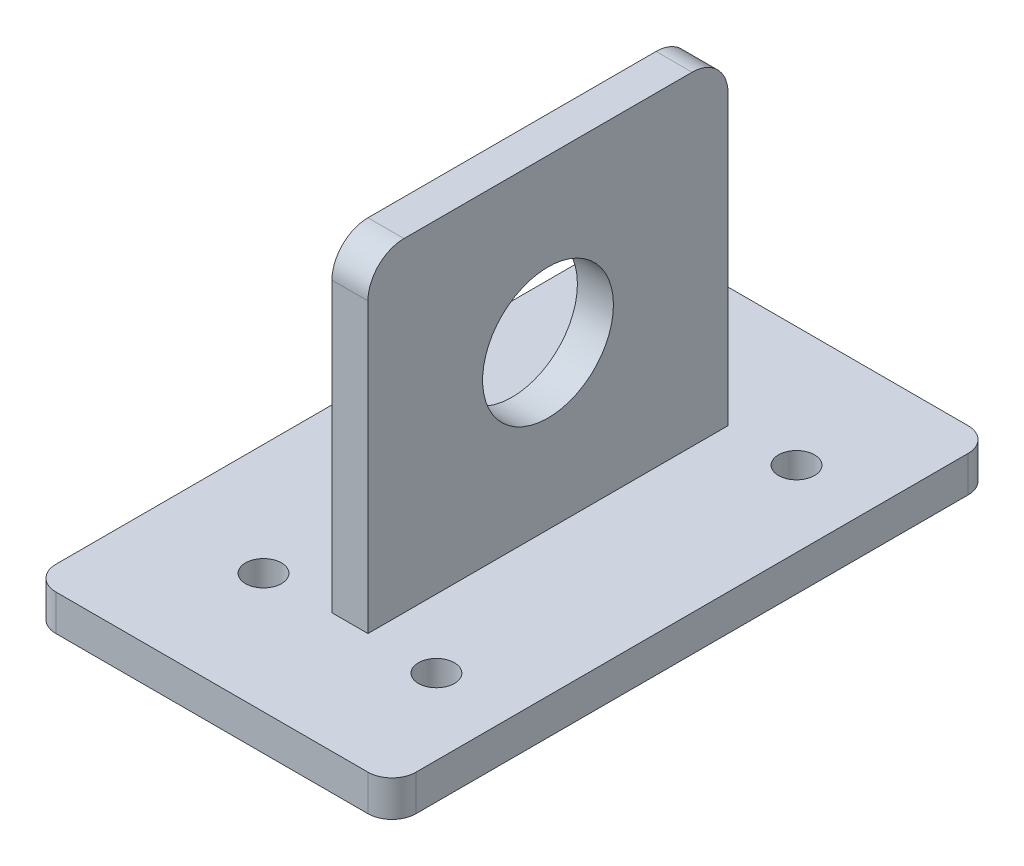
ISO-10303-21;
HEADER;
FILE_DESCRIPTION(('STEP AP214'),'2;1');
FILE_NAME('part.step','',(''),(''),'','','');
FILE_SCHEMA(('AUTOMOTIVE_DESIGN { 1 0 10303 214 1 1 1 1 }'));
ENDSEC;
DATA;
#1=APPLICATION_CONTEXT('core data for automotive mechanical design processes');
#2=APPLICATION_PROTOCOL_DEFINITION('international standard','automotive_design',2000,#1);
#3=PRODUCT_CONTEXT('',#1,'mechanical');
#4=PRODUCT('Part','Part','',(#3));
#5=PRODUCT_RELATED_PRODUCT_CATEGORY('part','',(#4));
#6=PRODUCT_DEFINITION_FORMATION('','',#4);
#7=PRODUCT_DEFINITION_CONTEXT('part definition',#1,'design');
#8=PRODUCT_DEFINITION('design','',#6,#7);
#9=PRODUCT_DEFINITION_SHAPE('','',#8);
#10=(LENGTH_UNIT() NAMED_UNIT(*) SI_UNIT(.MILLI.,.METRE.));
#11=(NAMED_UNIT(*) PLANE_ANGLE_UNIT() SI_UNIT($,.RADIAN.));
#12=(NAMED_UNIT(*) SI_UNIT($,.STERADIAN.) SOLID_ANGLE_UNIT());
#13=UNCERTAINTY_MEASURE_WITH_UNIT(LENGTH_MEASURE(1.E-05),#10,'distance_accuracy_value','');
#14=(GEOMETRIC_REPRESENTATION_CONTEXT(3) GLOBAL_UNCERTAINTY_ASSIGNED_CONTEXT((#13)) GLOBAL_UNIT_ASSIGNED_CONTEXT((#10,
#11,#12)) REPRESENTATION_CONTEXT('',''));
#15=CARTESIAN_POINT('',(0.,0.,0.));
#16=DIRECTION('',(0.,0.,1.));
#17=DIRECTION('',(1.,0.,0.));
#18=AXIS2_PLACEMENT_3D('',#15,#16,#17);
#19=CARTESIAN_POINT('',(0.,3.,0.));
#20=DIRECTION('',(0.,1.,0.));
#21=DIRECTION('',(0.,0.,1.));
#22=AXIS2_PLACEMENT_3D('',#19,#20,#21);
#23=PLANE('',#22);
#24=CARTESIAN_POINT('',(8.70350482965409,3.,15.));
#25=DIRECTION('',(0.,1.,0.));
#26=DIRECTION('',(0.,0.,-1.));
#27=AXIS2_PLACEMENT_3D('',#24,#25,#26);
#28=CIRCLE('',#27,1.5);
#29=CARTESIAN_POINT('',(8.70350482965409,3.,13.5));
#30=VERTEX_POINT('',#29);
#31=EDGE_CURVE('E280',#30,#30,#28,.T.);
#32=ORIENTED_EDGE('',*,*,#31,.F.);
#33=EDGE_LOOP('',(#32));
#34=FACE_BOUND('',#33,.T.);
#35=CARTESIAN_POINT('',(-5.70350482965409,3.,15.));
#36=DIRECTION('',(0.,-1.,0.));
#37=DIRECTION('',(0.,0.,-1.));
#38=AXIS2_PLACEMENT_3D('',#35,#36,#37);
#39=CIRCLE('',#38,1.5);
#40=CARTESIAN_POINT('',(-5.70350482965409,3.,13.5));
#41=VERTEX_POINT('',#40);
#42=EDGE_CURVE('E268',#41,#41,#39,.T.);
#43=ORIENTED_EDGE('',*,*,#42,.T.);
#44=EDGE_LOOP('',(#43));
#45=FACE_BOUND('',#44,.T.);
#46=CARTESIAN_POINT('',(-5.70350482965409,3.,-15.));
#47=DIRECTION('',(0.,1.,0.));
#48=DIRECTION('',(0.,0.,1.));
#49=AXIS2_PLACEMENT_3D('',#46,#47,#48);
#50=CIRCLE('',#49,1.5);
#51=CARTESIAN_POINT('',(-5.70350482965409,3.,-13.5));
#52=VERTEX_POINT('',#51);
#53=EDGE_CURVE('E262',#52,#52,#50,.T.);
#54=ORIENTED_EDGE('',*,*,#53,.F.);
#55=EDGE_LOOP('',(#54));
#56=FACE_BOUND('',#55,.T.);
#57=DIRECTION('',(0.,0.,-1.));
#58=VECTOR('',#57,1.);
#59=CARTESIAN_POINT('',(3.,3.,0.));
#60=LINE('',#59,#58);
#61=CARTESIAN_POINT('',(3.,3.,15.));
#62=VERTEX_POINT('',#61);
#63=CARTESIAN_POINT('',(3.,3.,-15.));
#64=VERTEX_POINT('',#63);
#65=EDGE_CURVE('E158',#62,#64,#60,.T.);
#66=ORIENTED_EDGE('',*,*,#65,.F.);
#67=DIRECTION('',(-1.,0.,0.));
#68=VECTOR('',#67,1.);
#69=CARTESIAN_POINT('',(0.,3.,15.));
#70=LINE('',#69,#68);
#71=CARTESIAN_POINT('',(0.,3.,15.));
#72=VERTEX_POINT('',#71);
#73=EDGE_CURVE('E144',#62,#72,#70,.T.);
#74=ORIENTED_EDGE('',*,*,#73,.T.);
#75=DIRECTION('',(0.,0.,-1.));
#76=VECTOR('',#75,1.);
#77=CARTESIAN_POINT('',(0.,3.,0.));
#78=LINE('',#77,#76);
#79=CARTESIAN_POINT('',(0.,3.,-15.));
#80=VERTEX_POINT('',#79);
#81=EDGE_CURVE('E153',#72,#80,#78,.T.);
#82=ORIENTED_EDGE('',*,*,#81,.T.);
#83=DIRECTION('',(1.,0.,0.));
#84=VECTOR('',#83,1.);
#85=CARTESIAN_POINT('',(0.,3.,-15.));
#86=LINE('',#85,#84);
#87=EDGE_CURVE('E163',#80,#64,#86,.T.);
#88=ORIENTED_EDGE('',*,*,#87,.T.);
#89=EDGE_LOOP('',(#66,#74,#82,#88));
#90=FACE_BOUND('',#89,.T.);
#91=DIRECTION('',(1.,0.,0.));
#92=VECTOR('',#91,1.);
#93=CARTESIAN_POINT('',(15.,3.,25.));
#94=LINE('',#93,#92);
#95=CARTESIAN_POINT('',(-13.,3.,25.));
#96=VERTEX_POINT('',#95);
#97=CARTESIAN_POINT('',(13.,3.,25.));
#98=VERTEX_POINT('',#97);
#99=EDGE_CURVE('E174',#96,#98,#94,.T.);
#100=ORIENTED_EDGE('',*,*,#99,.T.);
#101=CARTESIAN_POINT('',(13.,3.,23.));
#102=DIRECTION('',(0.,1.,0.));
#103=DIRECTION('',(0.,0.,1.));
#104=AXIS2_PLACEMENT_3D('',#101,#102,#103);
#105=CIRCLE('',#104,2.);
#106=CARTESIAN_POINT('',(15.,3.,23.));
#107=VERTEX_POINT('',#106);
#108=EDGE_CURVE('E215',#98,#107,#105,.T.);
#109=ORIENTED_EDGE('',*,*,#108,.T.);
#110=DIRECTION('',(0.,0.,-1.));
#111=VECTOR('',#110,1.);
#112=CARTESIAN_POINT('',(15.,3.,25.));
#113=LINE('',#112,#111);
#114=CARTESIAN_POINT('',(15.,3.,-23.));
#115=VERTEX_POINT('',#114);
#116=EDGE_CURVE('E178',#107,#115,#113,.T.);
#117=ORIENTED_EDGE('',*,*,#116,.T.);
#118=CARTESIAN_POINT('',(13.,3.,-23.));
#119=DIRECTION('',(0.,1.,0.));
#120=DIRECTION('',(0.,0.,1.));
#121=AXIS2_PLACEMENT_3D('',#118,#119,#120);
#122=CIRCLE('',#121,2.);
#123=CARTESIAN_POINT('',(13.,3.,-25.));
#124=VERTEX_POINT('',#123);
#125=EDGE_CURVE('E211',#115,#124,#122,.T.);
#126=ORIENTED_EDGE('',*,*,#125,.T.);
#127=DIRECTION('',(-1.,0.,0.));
#128=VECTOR('',#127,1.);
#129=CARTESIAN_POINT('',(15.,3.,-25.));
#130=LINE('',#129,#128);
#131=CARTESIAN_POINT('',(-13.,3.,-25.));
#132=VERTEX_POINT('',#131);
#133=EDGE_CURVE('E181',#124,#132,#130,.T.);
#134=ORIENTED_EDGE('',*,*,#133,.T.);
#135=CARTESIAN_POINT('',(-13.,3.,-23.));
#136=DIRECTION('',(0.,1.,0.));
#137=DIRECTION('',(0.,0.,1.));
#138=AXIS2_PLACEMENT_3D('',#135,#136,#137);
#139=CIRCLE('',#138,2.);
#140=CARTESIAN_POINT('',(-15.,3.,-23.));
#141=VERTEX_POINT('',#140);
#142=EDGE_CURVE('E209',#132,#141,#139,.T.);
#143=ORIENTED_EDGE('',*,*,#142,.T.);
#144=DIRECTION('',(0.,0.,1.));
#145=VECTOR('',#144,1.);
#146=CARTESIAN_POINT('',(-15.,3.,25.));
#147=LINE('',#146,#145);
#148=CARTESIAN_POINT('',(-15.,3.,23.));
#149=VERTEX_POINT('',#148);
#150=EDGE_CURVE('E171',#141,#149,#147,.T.);
#151=ORIENTED_EDGE('',*,*,#150,.T.);
#152=CARTESIAN_POINT('',(-13.,3.,23.));
#153=DIRECTION('',(0.,1.,0.));
#154=DIRECTION('',(0.,0.,1.));
#155=AXIS2_PLACEMENT_3D('',#152,#153,#154);
#156=CIRCLE('',#155,2.);
#157=EDGE_CURVE('E213',#149,#96,#156,.T.);
#158=ORIENTED_EDGE('',*,*,#157,.T.);
#159=EDGE_LOOP('',(#100,#109,#117,#126,#134,#143,#151,#158));
#160=FACE_BOUND('',#159,.T.);
#161=CARTESIAN_POINT('',(8.70350482965409,3.,-15.));
#162=DIRECTION('',(0.,-1.,0.));
#163=DIRECTION('',(0.,0.,1.));
#164=AXIS2_PLACEMENT_3D('',#161,#162,#163);
#165=CIRCLE('',#164,1.5);
#166=CARTESIAN_POINT('',(8.70350482965409,3.,-13.5));
#167=VERTEX_POINT('',#166);
#168=EDGE_CURVE('E274',#167,#167,#165,.T.);
#169=ORIENTED_EDGE('',*,*,#168,.T.);
#170=EDGE_LOOP('',(#169));
#171=FACE_BOUND('',#170,.T.);
#172=ADVANCED_FACE('F35',(#34,#45,#56,#90,#160,#171),#23,.T.);
#173=CARTESIAN_POINT('',(0.,0.,0.));
#174=DIRECTION('',(0.,1.,0.));
#175=DIRECTION('',(0.,0.,1.));
#176=AXIS2_PLACEMENT_3D('',#173,#174,#175);
#177=PLANE('',#176);
#178=CARTESIAN_POINT('',(8.70350482965409,0.,15.));
#179=DIRECTION('',(0.,1.,0.));
#180=DIRECTION('',(0.,0.,-1.));
#181=AXIS2_PLACEMENT_3D('',#178,#179,#180);
#182=CIRCLE('',#181,1.5);
#183=CARTESIAN_POINT('',(8.70350482965409,0.,13.5));
#184=VERTEX_POINT('',#183);
#185=EDGE_CURVE('E277',#184,#184,#182,.T.);
#186=ORIENTED_EDGE('',*,*,#185,.T.);
#187=EDGE_LOOP('',(#186));
#188=FACE_BOUND('',#187,.T.);
#189=CARTESIAN_POINT('',(-5.70350482965409,0.,15.));
#190=DIRECTION('',(0.,-1.,0.));
#191=DIRECTION('',(0.,0.,-1.));
#192=AXIS2_PLACEMENT_3D('',#189,#190,#191);
#193=CIRCLE('',#192,1.5);
#194=CARTESIAN_POINT('',(-5.70350482965409,0.,13.5));
#195=VERTEX_POINT('',#194);
#196=EDGE_CURVE('E265',#195,#195,#193,.T.);
#197=ORIENTED_EDGE('',*,*,#196,.F.);
#198=EDGE_LOOP('',(#197));
#199=FACE_BOUND('',#198,.T.);
#200=CARTESIAN_POINT('',(-5.70350482965409,0.,-15.));
#201=DIRECTION('',(0.,1.,0.));
#202=DIRECTION('',(0.,0.,1.));
#203=AXIS2_PLACEMENT_3D('',#200,#201,#202);
#204=CIRCLE('',#203,1.5);
#205=CARTESIAN_POINT('',(-5.70350482965409,0.,-13.5));
#206=VERTEX_POINT('',#205);
#207=EDGE_CURVE('E259',#206,#206,#204,.T.);
#208=ORIENTED_EDGE('',*,*,#207,.T.);
#209=EDGE_LOOP('',(#208));
#210=FACE_BOUND('',#209,.T.);
#211=DIRECTION('',(0.,0.,-1.));
#212=VECTOR('',#211,1.);
#213=CARTESIAN_POINT('',(15.,0.,25.));
#214=LINE('',#213,#212);
#215=CARTESIAN_POINT('',(15.,0.,23.));
#216=VERTEX_POINT('',#215);
#217=CARTESIAN_POINT('',(15.,0.,-23.));
#218=VERTEX_POINT('',#217);
#219=EDGE_CURVE('E187',#216,#218,#214,.T.);
#220=ORIENTED_EDGE('',*,*,#219,.F.);
#221=CARTESIAN_POINT('',(13.,0.,23.));
#222=DIRECTION('',(0.,1.,0.));
#223=DIRECTION('',(0.,0.,1.));
#224=AXIS2_PLACEMENT_3D('',#221,#222,#223);
#225=CIRCLE('',#224,2.);
#226=CARTESIAN_POINT('',(13.,0.,25.));
#227=VERTEX_POINT('',#226);
#228=EDGE_CURVE('E202',#216,#227,#225,.F.);
#229=ORIENTED_EDGE('',*,*,#228,.T.);
#230=DIRECTION('',(1.,0.,0.));
#231=VECTOR('',#230,1.);
#232=CARTESIAN_POINT('',(15.,0.,25.));
#233=LINE('',#232,#231);
#234=CARTESIAN_POINT('',(-13.,0.,25.));
#235=VERTEX_POINT('',#234);
#236=EDGE_CURVE('E166',#235,#227,#233,.T.);
#237=ORIENTED_EDGE('',*,*,#236,.F.);
#238=CARTESIAN_POINT('',(-13.,0.,23.));
#239=DIRECTION('',(0.,1.,0.));
#240=DIRECTION('',(0.,0.,1.));
#241=AXIS2_PLACEMENT_3D('',#238,#239,#240);
#242=CIRCLE('',#241,2.);
#243=CARTESIAN_POINT('',(-15.,0.,23.));
#244=VERTEX_POINT('',#243);
#245=EDGE_CURVE('E200',#235,#244,#242,.F.);
#246=ORIENTED_EDGE('',*,*,#245,.T.);
#247=DIRECTION('',(0.,0.,1.));
#248=VECTOR('',#247,1.);
#249=CARTESIAN_POINT('',(-15.,0.,25.));
#250=LINE('',#249,#248);
#251=CARTESIAN_POINT('',(-15.,0.,-23.));
#252=VERTEX_POINT('',#251);
#253=EDGE_CURVE('E162',#252,#244,#250,.T.);
#254=ORIENTED_EDGE('',*,*,#253,.F.);
#255=CARTESIAN_POINT('',(-13.,0.,-23.));
#256=DIRECTION('',(0.,1.,0.));
#257=DIRECTION('',(0.,0.,1.));
#258=AXIS2_PLACEMENT_3D('',#255,#256,#257);
#259=CIRCLE('',#258,2.);
#260=CARTESIAN_POINT('',(-13.,0.,-25.));
#261=VERTEX_POINT('',#260);
#262=EDGE_CURVE('E196',#252,#261,#259,.F.);
#263=ORIENTED_EDGE('',*,*,#262,.T.);
#264=DIRECTION('',(-1.,0.,0.));
#265=VECTOR('',#264,1.);
#266=CARTESIAN_POINT('',(15.,0.,-25.));
#267=LINE('',#266,#265);
#268=CARTESIAN_POINT('',(13.,0.,-25.));
#269=VERTEX_POINT('',#268);
#270=EDGE_CURVE('E175',#269,#261,#267,.T.);
#271=ORIENTED_EDGE('',*,*,#270,.F.);
#272=CARTESIAN_POINT('',(13.,0.,-23.));
#273=DIRECTION('',(0.,1.,0.));
#274=DIRECTION('',(0.,0.,1.));
#275=AXIS2_PLACEMENT_3D('',#272,#273,#274);
#276=CIRCLE('',#275,2.);
#277=EDGE_CURVE('E198',#269,#218,#276,.F.);
#278=ORIENTED_EDGE('',*,*,#277,.T.);
#279=EDGE_LOOP('',(#220,#229,#237,#246,#254,#263,#271,#278));
#280=FACE_BOUND('',#279,.T.);
#281=CARTESIAN_POINT('',(8.70350482965409,0.,-15.));
#282=DIRECTION('',(0.,-1.,0.));
#283=DIRECTION('',(0.,0.,1.));
#284=AXIS2_PLACEMENT_3D('',#281,#282,#283);
#285=CIRCLE('',#284,1.5);
#286=CARTESIAN_POINT('',(8.70350482965409,0.,-13.5));
#287=VERTEX_POINT('',#286);
#288=EDGE_CURVE('E271',#287,#287,#285,.T.);
#289=ORIENTED_EDGE('',*,*,#288,.F.);
#290=EDGE_LOOP('',(#289));
#291=FACE_BOUND('',#290,.T.);
#292=ADVANCED_FACE('F286',(#188,#199,#210,#280,#291),#177,.F.);
#293=CARTESIAN_POINT('',(-15.,3.,25.));
#294=DIRECTION('',(1.,0.,0.));
#295=DIRECTION('',(0.,0.,-1.));
#296=AXIS2_PLACEMENT_3D('',#293,#294,#295);
#297=PLANE('',#296);
#298=ORIENTED_EDGE('',*,*,#253,.T.);
#299=DIRECTION('',(0.,-1.,0.));
#300=VECTOR('',#299,1.);
#301=CARTESIAN_POINT('',(-15.,3.,23.));
#302=LINE('',#301,#300);
#303=EDGE_CURVE('E220',#244,#149,#302,.F.);
#304=ORIENTED_EDGE('',*,*,#303,.T.);
#305=ORIENTED_EDGE('',*,*,#150,.F.);
#306=DIRECTION('',(0.,-1.,0.));
#307=VECTOR('',#306,1.);
#308=CARTESIAN_POINT('',(-15.,3.,-23.));
#309=LINE('',#308,#307);
#310=EDGE_CURVE('E217',#141,#252,#309,.T.);
#311=ORIENTED_EDGE('',*,*,#310,.T.);
#312=EDGE_LOOP('',(#298,#304,#305,#311));
#313=FACE_BOUND('',#312,.T.);
#314=ADVANCED_FACE('F338',(#313),#297,.F.);
#315=CARTESIAN_POINT('',(15.,3.,25.));
#316=DIRECTION('',(0.,0.,-1.));
#317=DIRECTION('',(-1.,0.,0.));
#318=AXIS2_PLACEMENT_3D('',#315,#316,#317);
#319=PLANE('',#318);
#320=ORIENTED_EDGE('',*,*,#236,.T.);
#321=DIRECTION('',(0.,-1.,0.));
#322=VECTOR('',#321,1.);
#323=CARTESIAN_POINT('',(13.,3.,25.));
#324=LINE('',#323,#322);
#325=EDGE_CURVE('E207',#227,#98,#324,.F.);
#326=ORIENTED_EDGE('',*,*,#325,.T.);
#327=ORIENTED_EDGE('',*,*,#99,.F.);
#328=DIRECTION('',(0.,-1.,0.));
#329=VECTOR('',#328,1.);
#330=CARTESIAN_POINT('',(-13.,3.,25.));
#331=LINE('',#330,#329);
#332=EDGE_CURVE('E204',#96,#235,#331,.T.);
#333=ORIENTED_EDGE('',*,*,#332,.T.);
#334=EDGE_LOOP('',(#320,#326,#327,#333));
#335=FACE_BOUND('',#334,.T.);
#336=ADVANCED_FACE('F345',(#335),#319,.F.);
#337=CARTESIAN_POINT('',(15.,3.,25.));
#338=DIRECTION('',(-1.,0.,0.));
#339=DIRECTION('',(0.,0.,1.));
#340=AXIS2_PLACEMENT_3D('',#337,#338,#339);
#341=PLANE('',#340);
#342=ORIENTED_EDGE('',*,*,#116,.F.);
#343=DIRECTION('',(0.,-1.,0.));
#344=VECTOR('',#343,1.);
#345=CARTESIAN_POINT('',(15.,3.,23.));
#346=LINE('',#345,#344);
#347=EDGE_CURVE('E193',#107,#216,#346,.T.);
#348=ORIENTED_EDGE('',*,*,#347,.T.);
#349=ORIENTED_EDGE('',*,*,#219,.T.);
#350=DIRECTION('',(0.,-1.,0.));
#351=VECTOR('',#350,1.);
#352=CARTESIAN_POINT('',(15.,3.,-23.));
#353=LINE('',#352,#351);
#354=EDGE_CURVE('E183',#218,#115,#353,.F.);
#355=ORIENTED_EDGE('',*,*,#354,.T.);
#356=EDGE_LOOP('',(#342,#348,#349,#355));
#357=FACE_BOUND('',#356,.T.);
#358=ADVANCED_FACE('F341',(#357),#341,.F.);
#359=CARTESIAN_POINT('',(15.,3.,-25.));
#360=DIRECTION('',(0.,0.,1.));
#361=DIRECTION('',(1.,0.,0.));
#362=AXIS2_PLACEMENT_3D('',#359,#360,#361);
#363=PLANE('',#362);
#364=ORIENTED_EDGE('',*,*,#133,.F.);
#365=DIRECTION('',(0.,-1.,0.));
#366=VECTOR('',#365,1.);
#367=CARTESIAN_POINT('',(13.,3.,-25.));
#368=LINE('',#367,#366);
#369=EDGE_CURVE('E224',#124,#269,#368,.T.);
#370=ORIENTED_EDGE('',*,*,#369,.T.);
#371=ORIENTED_EDGE('',*,*,#270,.T.);
#372=DIRECTION('',(0.,-1.,0.));
#373=VECTOR('',#372,1.);
#374=CARTESIAN_POINT('',(-13.,3.,-25.));
#375=LINE('',#374,#373);
#376=EDGE_CURVE('E222',#261,#132,#375,.F.);
#377=ORIENTED_EDGE('',*,*,#376,.T.);
#378=EDGE_LOOP('',(#364,#370,#371,#377));
#379=FACE_BOUND('',#378,.T.);
#380=ADVANCED_FACE('F334',(#379),#363,.F.);
#381=CARTESIAN_POINT('',(3.,0.,15.));
#382=DIRECTION('',(0.,0.,-1.));
#383=DIRECTION('',(-1.,0.,0.));
#384=AXIS2_PLACEMENT_3D('',#381,#382,#383);
#385=PLANE('',#384);
#386=DIRECTION('',(0.,-1.,0.));
#387=VECTOR('',#386,1.);
#388=CARTESIAN_POINT('',(3.,0.,15.));
#389=LINE('',#388,#387);
#390=CARTESIAN_POINT('',(3.,27.,15.));
#391=VERTEX_POINT('',#390);
#392=EDGE_CURVE('E240',#391,#62,#389,.T.);
#393=ORIENTED_EDGE('',*,*,#392,.F.);
#394=DIRECTION('',(-1.,0.,0.));
#395=VECTOR('',#394,1.);
#396=CARTESIAN_POINT('',(3.,27.,15.));
#397=LINE('',#396,#395);
#398=CARTESIAN_POINT('',(0.,27.,15.));
#399=VERTEX_POINT('',#398);
#400=EDGE_CURVE('E147',#391,#399,#397,.T.);
#401=ORIENTED_EDGE('',*,*,#400,.T.);
#402=DIRECTION('',(0.,-1.,0.));
#403=VECTOR('',#402,1.);
#404=CARTESIAN_POINT('',(0.,0.,15.));
#405=LINE('',#404,#403);
#406=EDGE_CURVE('E139',#399,#72,#405,.T.);
#407=ORIENTED_EDGE('',*,*,#406,.T.);
#408=ORIENTED_EDGE('',*,*,#73,.F.);
#409=EDGE_LOOP('',(#393,#401,#407,#408));
#410=FACE_BOUND('',#409,.T.);
#411=ADVANCED_FACE('F142',(#410),#385,.F.);
#412=CARTESIAN_POINT('',(3.,0.,-15.));
#413=DIRECTION('',(0.,0.,1.));
#414=DIRECTION('',(1.,0.,0.));
#415=AXIS2_PLACEMENT_3D('',#412,#413,#414);
#416=PLANE('',#415);
#417=DIRECTION('',(0.,1.,0.));
#418=VECTOR('',#417,1.);
#419=CARTESIAN_POINT('',(0.,0.,-15.));
#420=LINE('',#419,#418);
#421=CARTESIAN_POINT('',(0.,27.,-15.));
#422=VERTEX_POINT('',#421);
#423=EDGE_CURVE('E149',#80,#422,#420,.T.);
#424=ORIENTED_EDGE('',*,*,#423,.T.);
#425=DIRECTION('',(-1.,0.,0.));
#426=VECTOR('',#425,1.);
#427=CARTESIAN_POINT('',(3.,27.,-15.));
#428=LINE('',#427,#426);
#429=CARTESIAN_POINT('',(3.,27.,-15.));
#430=VERTEX_POINT('',#429);
#431=EDGE_CURVE('E11',#422,#430,#428,.F.);
#432=ORIENTED_EDGE('',*,*,#431,.T.);
#433=DIRECTION('',(0.,1.,0.));
#434=VECTOR('',#433,1.);
#435=CARTESIAN_POINT('',(3.,0.,-15.));
#436=LINE('',#435,#434);
#437=EDGE_CURVE('E242',#64,#430,#436,.T.);
#438=ORIENTED_EDGE('',*,*,#437,.F.);
#439=ORIENTED_EDGE('',*,*,#87,.F.);
#440=EDGE_LOOP('',(#424,#432,#438,#439));
#441=FACE_BOUND('',#440,.T.);
#442=ADVANCED_FACE('F252',(#441),#416,.F.);
#443=CARTESIAN_POINT('',(3.,30.,-15.));
#444=DIRECTION('',(0.,-1.,0.));
#445=DIRECTION('',(0.,0.,-1.));
#446=AXIS2_PLACEMENT_3D('',#443,#444,#445);
#447=PLANE('',#446);
#448=DIRECTION('',(0.,0.,1.));
#449=VECTOR('',#448,1.);
#450=CARTESIAN_POINT('',(0.,30.,-15.));
#451=LINE('',#450,#449);
#452=CARTESIAN_POINT('',(0.,30.,-12.));
#453=VERTEX_POINT('',#452);
#454=CARTESIAN_POINT('',(0.,30.,12.));
#455=VERTEX_POINT('',#454);
#456=EDGE_CURVE('E243',#453,#455,#451,.T.);
#457=ORIENTED_EDGE('',*,*,#456,.T.);
#458=DIRECTION('',(-1.,0.,0.));
#459=VECTOR('',#458,1.);
#460=CARTESIAN_POINT('',(3.,30.,12.));
#461=LINE('',#460,#459);
#462=CARTESIAN_POINT('',(3.,30.,12.));
#463=VERTEX_POINT('',#462);
#464=EDGE_CURVE('E56',#455,#463,#461,.F.);
#465=ORIENTED_EDGE('',*,*,#464,.T.);
#466=DIRECTION('',(0.,0.,1.));
#467=VECTOR('',#466,1.);
#468=CARTESIAN_POINT('',(3.,30.,-15.));
#469=LINE('',#468,#467);
#470=CARTESIAN_POINT('',(3.,30.,-12.));
#471=VERTEX_POINT('',#470);
#472=EDGE_CURVE('E159',#471,#463,#469,.T.);
#473=ORIENTED_EDGE('',*,*,#472,.F.);
#474=DIRECTION('',(-1.,0.,0.));
#475=VECTOR('',#474,1.);
#476=CARTESIAN_POINT('',(3.,30.,-12.));
#477=LINE('',#476,#475);
#478=EDGE_CURVE('E232',#471,#453,#477,.T.);
#479=ORIENTED_EDGE('',*,*,#478,.T.);
#480=EDGE_LOOP('',(#457,#465,#473,#479));
#481=FACE_BOUND('',#480,.T.);
#482=ADVANCED_FACE('F247',(#481),#447,.F.);
#483=CARTESIAN_POINT('',(3.,0.,0.));
#484=DIRECTION('',(1.,0.,0.));
#485=DIRECTION('',(0.,0.,-1.));
#486=AXIS2_PLACEMENT_3D('',#483,#484,#485);
#487=PLANE('',#486);
#488=CARTESIAN_POINT('',(3.,16.5,0.));
#489=DIRECTION('',(1.,0.,0.));
#490=DIRECTION('',(0.,0.,-1.));
#491=AXIS2_PLACEMENT_3D('',#488,#489,#490);
#492=CIRCLE('',#491,5.45);
#493=CARTESIAN_POINT('',(3.,16.5,-5.45));
#494=VERTEX_POINT('',#493);
#495=EDGE_CURVE('E256',#494,#494,#492,.T.);
#496=ORIENTED_EDGE('',*,*,#495,.F.);
#497=EDGE_LOOP('',(#496));
#498=FACE_BOUND('',#497,.T.);
#499=ORIENTED_EDGE('',*,*,#472,.T.);
#500=CARTESIAN_POINT('',(3.,27.,12.));
#501=DIRECTION('',(1.,0.,0.));
#502=DIRECTION('',(0.,0.,-1.));
#503=AXIS2_PLACEMENT_3D('',#500,#501,#502);
#504=CIRCLE('',#503,3.);
#505=EDGE_CURVE('E43',#463,#391,#504,.T.);
#506=ORIENTED_EDGE('',*,*,#505,.T.);
#507=ORIENTED_EDGE('',*,*,#392,.T.);
#508=ORIENTED_EDGE('',*,*,#65,.T.);
#509=ORIENTED_EDGE('',*,*,#437,.T.);
#510=CARTESIAN_POINT('',(3.,27.,-12.));
#511=DIRECTION('',(1.,0.,0.));
#512=DIRECTION('',(0.,0.,-1.));
#513=AXIS2_PLACEMENT_3D('',#510,#511,#512);
#514=CIRCLE('',#513,3.);
#515=EDGE_CURVE('E236',#430,#471,#514,.T.);
#516=ORIENTED_EDGE('',*,*,#515,.T.);
#517=EDGE_LOOP('',(#499,#506,#507,#508,#509,#516));
#518=FACE_BOUND('',#517,.T.);
#519=ADVANCED_FACE('F239',(#498,#518),#487,.T.);
#520=CARTESIAN_POINT('',(0.,0.,0.));
#521=DIRECTION('',(1.,0.,0.));
#522=DIRECTION('',(0.,0.,-1.));
#523=AXIS2_PLACEMENT_3D('',#520,#521,#522);
#524=PLANE('',#523);
#525=CARTESIAN_POINT('',(0.,16.5,0.));
#526=DIRECTION('',(1.,0.,0.));
#527=DIRECTION('',(0.,0.,-1.));
#528=AXIS2_PLACEMENT_3D('',#525,#526,#527);
#529=CIRCLE('',#528,5.45);
#530=CARTESIAN_POINT('',(0.,16.5,-5.45));
#531=VERTEX_POINT('',#530);
#532=EDGE_CURVE('E150',#531,#531,#529,.T.);
#533=ORIENTED_EDGE('',*,*,#532,.T.);
#534=EDGE_LOOP('',(#533));
#535=FACE_BOUND('',#534,.T.);
#536=ORIENTED_EDGE('',*,*,#406,.F.);
#537=CARTESIAN_POINT('',(0.,27.,12.));
#538=DIRECTION('',(1.,0.,0.));
#539=DIRECTION('',(0.,0.,-1.));
#540=AXIS2_PLACEMENT_3D('',#537,#538,#539);
#541=CIRCLE('',#540,3.);
#542=EDGE_CURVE('E230',#399,#455,#541,.F.);
#543=ORIENTED_EDGE('',*,*,#542,.T.);
#544=ORIENTED_EDGE('',*,*,#456,.F.);
#545=CARTESIAN_POINT('',(0.,27.,-12.));
#546=DIRECTION('',(1.,0.,0.));
#547=DIRECTION('',(0.,0.,-1.));
#548=AXIS2_PLACEMENT_3D('',#545,#546,#547);
#549=CIRCLE('',#548,3.);
#550=EDGE_CURVE('E228',#453,#422,#549,.F.);
#551=ORIENTED_EDGE('',*,*,#550,.T.);
#552=ORIENTED_EDGE('',*,*,#423,.F.);
#553=ORIENTED_EDGE('',*,*,#81,.F.);
#554=EDGE_LOOP('',(#536,#543,#544,#551,#552,#553));
#555=FACE_BOUND('',#554,.T.);
#556=ADVANCED_FACE('F154',(#535,#555),#524,.F.);
#557=CARTESIAN_POINT('',(0.,16.5,0.));
#558=DIRECTION('',(1.,0.,0.));
#559=DIRECTION('',(0.,0.,-1.));
#560=AXIS2_PLACEMENT_3D('',#557,#558,#559);
#561=CYLINDRICAL_SURFACE('',#560,5.45);
#562=ORIENTED_EDGE('',*,*,#532,.F.);
#563=EDGE_LOOP('',(#562));
#564=FACE_BOUND('',#563,.T.);
#565=ORIENTED_EDGE('',*,*,#495,.T.);
#566=EDGE_LOOP('',(#565));
#567=FACE_BOUND('',#566,.T.);
#568=ADVANCED_FACE('F318',(#564,#567),#561,.F.);
#569=CARTESIAN_POINT('',(13.,3.,23.));
#570=DIRECTION('',(0.,-1.,0.));
#571=DIRECTION('',(0.,0.,-1.));
#572=AXIS2_PLACEMENT_3D('',#569,#570,#571);
#573=CYLINDRICAL_SURFACE('',#572,2.);
#574=ORIENTED_EDGE('',*,*,#108,.F.);
#575=ORIENTED_EDGE('',*,*,#325,.F.);
#576=ORIENTED_EDGE('',*,*,#228,.F.);
#577=ORIENTED_EDGE('',*,*,#347,.F.);
#578=EDGE_LOOP('',(#574,#575,#576,#577));
#579=FACE_BOUND('',#578,.T.);
#580=ADVANCED_FACE('F321',(#579),#573,.T.);
#581=CARTESIAN_POINT('',(-13.,3.,23.));
#582=DIRECTION('',(0.,-1.,0.));
#583=DIRECTION('',(0.,0.,-1.));
#584=AXIS2_PLACEMENT_3D('',#581,#582,#583);
#585=CYLINDRICAL_SURFACE('',#584,2.);
#586=ORIENTED_EDGE('',*,*,#157,.F.);
#587=ORIENTED_EDGE('',*,*,#303,.F.);
#588=ORIENTED_EDGE('',*,*,#245,.F.);
#589=ORIENTED_EDGE('',*,*,#332,.F.);
#590=EDGE_LOOP('',(#586,#587,#588,#589));
#591=FACE_BOUND('',#590,.T.);
#592=ADVANCED_FACE('F355',(#591),#585,.T.);
#593=CARTESIAN_POINT('',(13.,3.,-23.));
#594=DIRECTION('',(0.,-1.,0.));
#595=DIRECTION('',(0.,0.,-1.));
#596=AXIS2_PLACEMENT_3D('',#593,#594,#595);
#597=CYLINDRICAL_SURFACE('',#596,2.);
#598=ORIENTED_EDGE('',*,*,#125,.F.);
#599=ORIENTED_EDGE('',*,*,#354,.F.);
#600=ORIENTED_EDGE('',*,*,#277,.F.);
#601=ORIENTED_EDGE('',*,*,#369,.F.);
#602=EDGE_LOOP('',(#598,#599,#600,#601));
#603=FACE_BOUND('',#602,.T.);
#604=ADVANCED_FACE('F359',(#603),#597,.T.);
#605=CARTESIAN_POINT('',(-13.,3.,-23.));
#606=DIRECTION('',(0.,-1.,0.));
#607=DIRECTION('',(0.,0.,-1.));
#608=AXIS2_PLACEMENT_3D('',#605,#606,#607);
#609=CYLINDRICAL_SURFACE('',#608,2.);
#610=ORIENTED_EDGE('',*,*,#142,.F.);
#611=ORIENTED_EDGE('',*,*,#376,.F.);
#612=ORIENTED_EDGE('',*,*,#262,.F.);
#613=ORIENTED_EDGE('',*,*,#310,.F.);
#614=EDGE_LOOP('',(#610,#611,#612,#613));
#615=FACE_BOUND('',#614,.T.);
#616=ADVANCED_FACE('F363',(#615),#609,.T.);
#617=CARTESIAN_POINT('',(3.,27.,12.));
#618=DIRECTION('',(-1.,0.,0.));
#619=DIRECTION('',(0.,0.,1.));
#620=AXIS2_PLACEMENT_3D('',#617,#618,#619);
#621=CYLINDRICAL_SURFACE('',#620,3.);
#622=ORIENTED_EDGE('',*,*,#505,.F.);
#623=ORIENTED_EDGE('',*,*,#464,.F.);
#624=ORIENTED_EDGE('',*,*,#542,.F.);
#625=ORIENTED_EDGE('',*,*,#400,.F.);
#626=EDGE_LOOP('',(#622,#623,#624,#625));
#627=FACE_BOUND('',#626,.T.);
#628=ADVANCED_FACE('F245',(#627),#621,.T.);
#629=CARTESIAN_POINT('',(3.,27.,-12.));
#630=DIRECTION('',(-1.,0.,0.));
#631=DIRECTION('',(0.,0.,1.));
#632=AXIS2_PLACEMENT_3D('',#629,#630,#631);
#633=CYLINDRICAL_SURFACE('',#632,3.);
#634=ORIENTED_EDGE('',*,*,#515,.F.);
#635=ORIENTED_EDGE('',*,*,#431,.F.);
#636=ORIENTED_EDGE('',*,*,#550,.F.);
#637=ORIENTED_EDGE('',*,*,#478,.F.);
#638=EDGE_LOOP('',(#634,#635,#636,#637));
#639=FACE_BOUND('',#638,.T.);
#640=ADVANCED_FACE('F37',(#639),#633,.T.);
#641=CARTESIAN_POINT('',(-5.70350482965409,0.,-15.));
#642=DIRECTION('',(0.,1.,0.));
#643=DIRECTION('',(0.,0.,1.));
#644=AXIS2_PLACEMENT_3D('',#641,#642,#643);
#645=CYLINDRICAL_SURFACE('',#644,1.5);
#646=ORIENTED_EDGE('',*,*,#207,.F.);
#647=EDGE_LOOP('',(#646));
#648=FACE_BOUND('',#647,.T.);
#649=ORIENTED_EDGE('',*,*,#53,.T.);
#650=EDGE_LOOP('',(#649));
#651=FACE_BOUND('',#650,.T.);
#652=ADVANCED_FACE('F303',(#648,#651),#645,.F.);
#653=CARTESIAN_POINT('',(-5.70350482965409,0.,15.));
#654=DIRECTION('',(0.,1.,0.));
#655=DIRECTION('',(0.,0.,1.));
#656=AXIS2_PLACEMENT_3D('',#653,#654,#655);
#657=CYLINDRICAL_SURFACE('',#656,1.5);
#658=ORIENTED_EDGE('',*,*,#196,.T.);
#659=EDGE_LOOP('',(#658));
#660=FACE_BOUND('',#659,.T.);
#661=ORIENTED_EDGE('',*,*,#42,.F.);
#662=EDGE_LOOP('',(#661));
#663=FACE_BOUND('',#662,.T.);
#664=ADVANCED_FACE('F305',(#660,#663),#657,.F.);
#665=CARTESIAN_POINT('',(8.70350482965409,0.,-15.));
#666=DIRECTION('',(0.,1.,0.));
#667=DIRECTION('',(0.,0.,1.));
#668=AXIS2_PLACEMENT_3D('',#665,#666,#667);
#669=CYLINDRICAL_SURFACE('',#668,1.5);
#670=ORIENTED_EDGE('',*,*,#288,.T.);
#671=EDGE_LOOP('',(#670));
#672=FACE_BOUND('',#671,.T.);
#673=ORIENTED_EDGE('',*,*,#168,.F.);
#674=EDGE_LOOP('',(#673));
#675=FACE_BOUND('',#674,.T.);
#676=ADVANCED_FACE('F292',(#672,#675),#669,.F.);
#677=CARTESIAN_POINT('',(8.70350482965409,0.,15.));
#678=DIRECTION('',(0.,1.,0.));
#679=DIRECTION('',(0.,0.,1.));
#680=AXIS2_PLACEMENT_3D('',#677,#678,#679);
#681=CYLINDRICAL_SURFACE('',#680,1.5);
#682=ORIENTED_EDGE('',*,*,#185,.F.);
#683=EDGE_LOOP('',(#682));
#684=FACE_BOUND('',#683,.T.);
#685=ORIENTED_EDGE('',*,*,#31,.T.);
#686=EDGE_LOOP('',(#685));
#687=FACE_BOUND('',#686,.T.);
#688=ADVANCED_FACE('F289',(#684,#687),#681,.F.);
#689=CLOSED_SHELL('',(#172,#292,#314,#336,#358,#380,#411,#442,#482,#519,#556,#568,#580,#592,
#604,#616,#628,#640,#652,#664,#676,#688));
#690=MANIFOLD_SOLID_BREP('B2',#689);
#691=ADVANCED_BREP_SHAPE_REPRESENTATION('',(#18,#690),#14);
#692=SHAPE_DEFINITION_REPRESENTATION(#9,#691);
ENDSEC;
END-ISO-10303-21;
